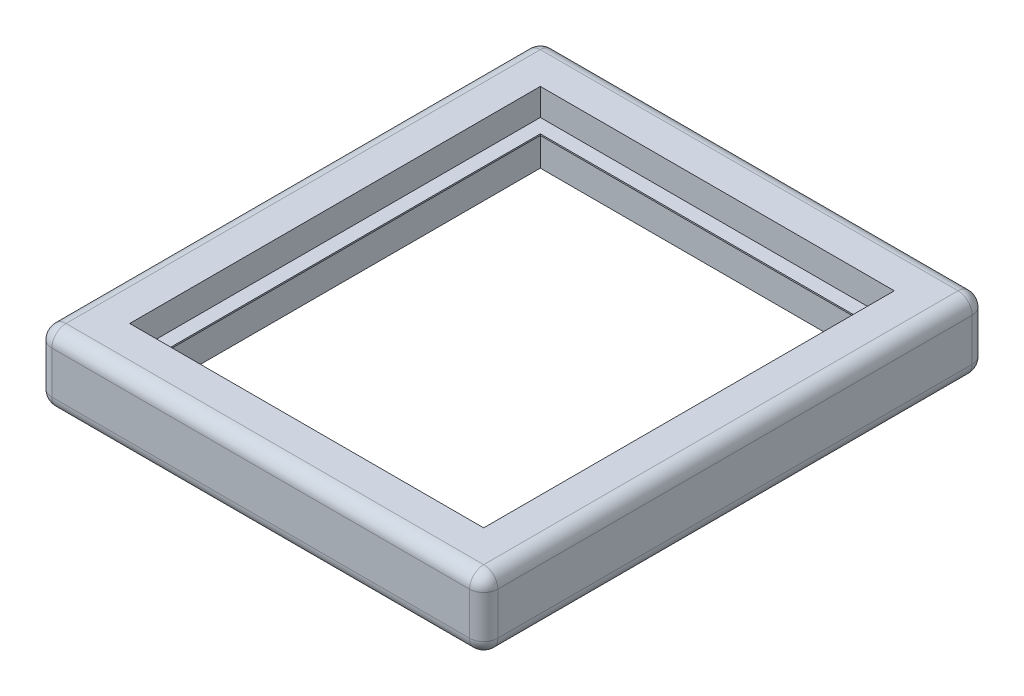
ISO-10303-21;
HEADER;
FILE_DESCRIPTION(('STEP AP214'),'2;1');
FILE_NAME('part.step','',(''),(''),'','','');
FILE_SCHEMA(('AUTOMOTIVE_DESIGN { 1 0 10303 214 1 1 1 1 }'));
ENDSEC;
DATA;
#1=APPLICATION_CONTEXT('core data for automotive mechanical design processes');
#2=APPLICATION_PROTOCOL_DEFINITION('international standard','automotive_design',2000,#1);
#3=PRODUCT_CONTEXT('',#1,'mechanical');
#4=PRODUCT('Part','Part','',(#3));
#5=PRODUCT_RELATED_PRODUCT_CATEGORY('part','',(#4));
#6=PRODUCT_DEFINITION_FORMATION('','',#4);
#7=PRODUCT_DEFINITION_CONTEXT('part definition',#1,'design');
#8=PRODUCT_DEFINITION('design','',#6,#7);
#9=PRODUCT_DEFINITION_SHAPE('','',#8);
#10=(LENGTH_UNIT() NAMED_UNIT(*) SI_UNIT(.MILLI.,.METRE.));
#11=(NAMED_UNIT(*) PLANE_ANGLE_UNIT() SI_UNIT($,.RADIAN.));
#12=(NAMED_UNIT(*) SI_UNIT($,.STERADIAN.) SOLID_ANGLE_UNIT());
#13=UNCERTAINTY_MEASURE_WITH_UNIT(LENGTH_MEASURE(1.E-05),#10,'distance_accuracy_value','');
#14=(GEOMETRIC_REPRESENTATION_CONTEXT(3) GLOBAL_UNCERTAINTY_ASSIGNED_CONTEXT((#13)) GLOBAL_UNIT_ASSIGNED_CONTEXT((#10,
#11,#12)) REPRESENTATION_CONTEXT('',''));
#15=CARTESIAN_POINT('',(0.,0.,0.));
#16=DIRECTION('',(0.,0.,1.));
#17=DIRECTION('',(1.,0.,0.));
#18=AXIS2_PLACEMENT_3D('',#15,#16,#17);
#19=CARTESIAN_POINT('',(317.5,-76.2,0.));
#20=DIRECTION('',(1.,0.,0.));
#21=DIRECTION('',(0.,0.,-1.));
#22=AXIS2_PLACEMENT_3D('',#19,#20,#21);
#23=PLANE('',#22);
#24=DIRECTION('',(0.,0.,-1.));
#25=VECTOR('',#24,1.);
#26=CARTESIAN_POINT('',(317.5,0.,0.));
#27=LINE('',#26,#25);
#28=CARTESIAN_POINT('',(317.5,0.,368.3));
#29=VERTEX_POINT('',#28);
#30=CARTESIAN_POINT('',(317.5,0.,-368.3));
#31=VERTEX_POINT('',#30);
#32=EDGE_CURVE('E420',#29,#31,#27,.T.);
#33=ORIENTED_EDGE('',*,*,#32,.T.);
#34=DIRECTION('',(0.,1.,0.));
#35=VECTOR('',#34,1.);
#36=CARTESIAN_POINT('',(317.5,-76.2,-368.3));
#37=LINE('',#36,#35);
#38=CARTESIAN_POINT('',(317.5,-76.2,-368.3));
#39=VERTEX_POINT('',#38);
#40=EDGE_CURVE('E256',#39,#31,#37,.T.);
#41=ORIENTED_EDGE('',*,*,#40,.F.);
#42=DIRECTION('',(0.,0.,-1.));
#43=VECTOR('',#42,1.);
#44=CARTESIAN_POINT('',(317.5,-76.2,0.));
#45=LINE('',#44,#43);
#46=CARTESIAN_POINT('',(317.5,-76.2,368.3));
#47=VERTEX_POINT('',#46);
#48=EDGE_CURVE('E480',#47,#39,#45,.T.);
#49=ORIENTED_EDGE('',*,*,#48,.F.);
#50=DIRECTION('',(0.,1.,0.));
#51=VECTOR('',#50,1.);
#52=CARTESIAN_POINT('',(317.5,-76.2,368.3));
#53=LINE('',#52,#51);
#54=EDGE_CURVE('E238',#47,#29,#53,.T.);
#55=ORIENTED_EDGE('',*,*,#54,.T.);
#56=EDGE_LOOP('',(#33,#41,#49,#55));
#57=FACE_BOUND('',#56,.T.);
#58=ADVANCED_FACE('F45',(#57),#23,.F.);
#59=CARTESIAN_POINT('',(0.,-76.2,-368.3));
#60=DIRECTION('',(0.,0.,1.));
#61=DIRECTION('',(1.,0.,0.));
#62=AXIS2_PLACEMENT_3D('',#59,#60,#61);
#63=PLANE('',#62);
#64=ORIENTED_EDGE('',*,*,#40,.T.);
#65=DIRECTION('',(1.,0.,0.));
#66=VECTOR('',#65,1.);
#67=CARTESIAN_POINT('',(0.,0.,-368.3));
#68=LINE('',#67,#66);
#69=CARTESIAN_POINT('',(-317.5,0.,-368.3));
#70=VERTEX_POINT('',#69);
#71=EDGE_CURVE('E426',#70,#31,#68,.T.);
#72=ORIENTED_EDGE('',*,*,#71,.F.);
#73=DIRECTION('',(0.,1.,0.));
#74=VECTOR('',#73,1.);
#75=CARTESIAN_POINT('',(-317.5,-76.2,-368.3));
#76=LINE('',#75,#74);
#77=CARTESIAN_POINT('',(-317.5,-76.2,-368.3));
#78=VERTEX_POINT('',#77);
#79=EDGE_CURVE('E491',#78,#70,#76,.T.);
#80=ORIENTED_EDGE('',*,*,#79,.F.);
#81=DIRECTION('',(1.,0.,0.));
#82=VECTOR('',#81,1.);
#83=CARTESIAN_POINT('',(0.,-76.2,-368.3));
#84=LINE('',#83,#82);
#85=EDGE_CURVE('E239',#78,#39,#84,.T.);
#86=ORIENTED_EDGE('',*,*,#85,.T.);
#87=EDGE_LOOP('',(#64,#72,#80,#86));
#88=FACE_BOUND('',#87,.T.);
#89=ADVANCED_FACE('F557',(#88),#63,.T.);
#90=CARTESIAN_POINT('',(-317.5,-76.2,0.));
#91=DIRECTION('',(1.,0.,0.));
#92=DIRECTION('',(0.,0.,-1.));
#93=AXIS2_PLACEMENT_3D('',#90,#91,#92);
#94=PLANE('',#93);
#95=ORIENTED_EDGE('',*,*,#79,.T.);
#96=DIRECTION('',(0.,0.,-1.));
#97=VECTOR('',#96,1.);
#98=CARTESIAN_POINT('',(-317.5,0.,0.));
#99=LINE('',#98,#97);
#100=CARTESIAN_POINT('',(-317.5,0.,368.3));
#101=VERTEX_POINT('',#100);
#102=EDGE_CURVE('E435',#101,#70,#99,.T.);
#103=ORIENTED_EDGE('',*,*,#102,.F.);
#104=DIRECTION('',(0.,1.,0.));
#105=VECTOR('',#104,1.);
#106=CARTESIAN_POINT('',(-317.5,-76.2,368.3));
#107=LINE('',#106,#105);
#108=CARTESIAN_POINT('',(-317.5,-76.2,368.3));
#109=VERTEX_POINT('',#108);
#110=EDGE_CURVE('E250',#109,#101,#107,.T.);
#111=ORIENTED_EDGE('',*,*,#110,.F.);
#112=DIRECTION('',(0.,0.,-1.));
#113=VECTOR('',#112,1.);
#114=CARTESIAN_POINT('',(-317.5,-76.2,0.));
#115=LINE('',#114,#113);
#116=EDGE_CURVE('E246',#109,#78,#115,.T.);
#117=ORIENTED_EDGE('',*,*,#116,.T.);
#118=EDGE_LOOP('',(#95,#103,#111,#117));
#119=FACE_BOUND('',#118,.T.);
#120=ADVANCED_FACE('F563',(#119),#94,.T.);
#121=CARTESIAN_POINT('',(0.,-76.2,368.3));
#122=DIRECTION('',(0.,0.,1.));
#123=DIRECTION('',(1.,0.,0.));
#124=AXIS2_PLACEMENT_3D('',#121,#122,#123);
#125=PLANE('',#124);
#126=DIRECTION('',(1.,0.,0.));
#127=VECTOR('',#126,1.);
#128=CARTESIAN_POINT('',(0.,0.,368.3));
#129=LINE('',#128,#127);
#130=EDGE_CURVE('E414',#101,#29,#129,.T.);
#131=ORIENTED_EDGE('',*,*,#130,.T.);
#132=ORIENTED_EDGE('',*,*,#54,.F.);
#133=DIRECTION('',(1.,0.,0.));
#134=VECTOR('',#133,1.);
#135=CARTESIAN_POINT('',(0.,-76.2,368.3));
#136=LINE('',#135,#134);
#137=EDGE_CURVE('E483',#109,#47,#136,.T.);
#138=ORIENTED_EDGE('',*,*,#137,.F.);
#139=ORIENTED_EDGE('',*,*,#110,.T.);
#140=EDGE_LOOP('',(#131,#132,#138,#139));
#141=FACE_BOUND('',#140,.T.);
#142=ADVANCED_FACE('F569',(#141),#125,.F.);
#143=CARTESIAN_POINT('',(317.5,2.54,-368.3));
#144=VERTEX_POINT('',#143);
#145=CARTESIAN_POINT('',(317.5,50.8,-368.3));
#146=VERTEX_POINT('',#145);
#147=EDGE_CURVE('E229',#144,#146,#37,.T.);
#148=ORIENTED_EDGE('',*,*,#147,.F.);
#149=DIRECTION('',(0.,0.,-1.));
#150=VECTOR('',#149,1.);
#151=CARTESIAN_POINT('',(317.5,2.54,0.));
#152=LINE('',#151,#150);
#153=CARTESIAN_POINT('',(317.5,2.54,368.3));
#154=VERTEX_POINT('',#153);
#155=EDGE_CURVE('E213',#154,#144,#152,.T.);
#156=ORIENTED_EDGE('',*,*,#155,.F.);
#157=CARTESIAN_POINT('',(317.5,50.8,368.3));
#158=VERTEX_POINT('',#157);
#159=EDGE_CURVE('E227',#154,#158,#53,.T.);
#160=ORIENTED_EDGE('',*,*,#159,.T.);
#161=DIRECTION('',(0.,0.,-1.));
#162=VECTOR('',#161,1.);
#163=CARTESIAN_POINT('',(317.5,50.8,0.));
#164=LINE('',#163,#162);
#165=EDGE_CURVE('E467',#158,#146,#164,.T.);
#166=ORIENTED_EDGE('',*,*,#165,.T.);
#167=EDGE_LOOP('',(#148,#156,#160,#166));
#168=FACE_BOUND('',#167,.T.);
#169=ADVANCED_FACE('F225',(#168),#23,.F.);
#170=DIRECTION('',(1.,0.,0.));
#171=VECTOR('',#170,1.);
#172=CARTESIAN_POINT('',(0.,2.54,-368.3));
#173=LINE('',#172,#171);
#174=CARTESIAN_POINT('',(-317.5,2.54,-368.3));
#175=VERTEX_POINT('',#174);
#176=EDGE_CURVE('E231',#175,#144,#173,.T.);
#177=ORIENTED_EDGE('',*,*,#176,.T.);
#178=ORIENTED_EDGE('',*,*,#147,.T.);
#179=DIRECTION('',(1.,0.,0.));
#180=VECTOR('',#179,1.);
#181=CARTESIAN_POINT('',(0.,50.8,-368.3));
#182=LINE('',#181,#180);
#183=CARTESIAN_POINT('',(-317.5,50.8,-368.3));
#184=VERTEX_POINT('',#183);
#185=EDGE_CURVE('E476',#184,#146,#182,.T.);
#186=ORIENTED_EDGE('',*,*,#185,.F.);
#187=EDGE_CURVE('E494',#175,#184,#76,.T.);
#188=ORIENTED_EDGE('',*,*,#187,.F.);
#189=EDGE_LOOP('',(#177,#178,#186,#188));
#190=FACE_BOUND('',#189,.T.);
#191=ADVANCED_FACE('F510',(#190),#63,.T.);
#192=DIRECTION('',(0.,0.,-1.));
#193=VECTOR('',#192,1.);
#194=CARTESIAN_POINT('',(-317.5,2.54,0.));
#195=LINE('',#194,#193);
#196=CARTESIAN_POINT('',(-317.5,2.53999999999997,368.3));
#197=VERTEX_POINT('',#196);
#198=EDGE_CURVE('E216',#197,#175,#195,.T.);
#199=ORIENTED_EDGE('',*,*,#198,.T.);
#200=ORIENTED_EDGE('',*,*,#187,.T.);
#201=DIRECTION('',(0.,0.,-1.));
#202=VECTOR('',#201,1.);
#203=CARTESIAN_POINT('',(-317.5,50.8,0.));
#204=LINE('',#203,#202);
#205=CARTESIAN_POINT('',(-317.5,50.8,368.3));
#206=VERTEX_POINT('',#205);
#207=EDGE_CURVE('E472',#206,#184,#204,.T.);
#208=ORIENTED_EDGE('',*,*,#207,.F.);
#209=EDGE_CURVE('E244',#197,#206,#107,.T.);
#210=ORIENTED_EDGE('',*,*,#209,.F.);
#211=EDGE_LOOP('',(#199,#200,#208,#210));
#212=FACE_BOUND('',#211,.T.);
#213=ADVANCED_FACE('F506',(#212),#94,.T.);
#214=CARTESIAN_POINT('',(-400.05,-76.2,0.));
#215=DIRECTION('',(1.,0.,0.));
#216=DIRECTION('',(0.,0.,-1.));
#217=AXIS2_PLACEMENT_3D('',#214,#215,#216);
#218=PLANE('',#217);
#219=DIRECTION('',(0.,1.,0.));
#220=VECTOR('',#219,1.);
#221=CARTESIAN_POINT('',(-400.05,-76.2,-425.45));
#222=LINE('',#221,#220);
#223=CARTESIAN_POINT('',(-400.05,25.4,-425.45));
#224=VERTEX_POINT('',#223);
#225=CARTESIAN_POINT('',(-400.05,-50.8,-425.45));
#226=VERTEX_POINT('',#225);
#227=EDGE_CURVE('E55',#224,#226,#222,.F.);
#228=ORIENTED_EDGE('',*,*,#227,.T.);
#229=DIRECTION('',(0.,0.,-1.));
#230=VECTOR('',#229,1.);
#231=CARTESIAN_POINT('',(-400.05,-50.8,0.));
#232=LINE('',#231,#230);
#233=CARTESIAN_POINT('',(-400.05,-50.8,425.45));
#234=VERTEX_POINT('',#233);
#235=EDGE_CURVE('E11',#226,#234,#232,.F.);
#236=ORIENTED_EDGE('',*,*,#235,.T.);
#237=DIRECTION('',(0.,1.,0.));
#238=VECTOR('',#237,1.);
#239=CARTESIAN_POINT('',(-400.05,50.8,425.45));
#240=LINE('',#239,#238);
#241=CARTESIAN_POINT('',(-400.05,25.4,425.45));
#242=VERTEX_POINT('',#241);
#243=EDGE_CURVE('E321',#234,#242,#240,.T.);
#244=ORIENTED_EDGE('',*,*,#243,.T.);
#245=DIRECTION('',(0.,0.,-1.));
#246=VECTOR('',#245,1.);
#247=CARTESIAN_POINT('',(-400.05,25.4,-450.85));
#248=LINE('',#247,#246);
#249=EDGE_CURVE('E318',#242,#224,#248,.T.);
#250=ORIENTED_EDGE('',*,*,#249,.T.);
#251=EDGE_LOOP('',(#228,#236,#244,#250));
#252=FACE_BOUND('',#251,.T.);
#253=ADVANCED_FACE('F597',(#252),#218,.F.);
#254=CARTESIAN_POINT('',(0.,-76.2,-450.85));
#255=DIRECTION('',(0.,0.,1.));
#256=DIRECTION('',(1.,0.,0.));
#257=AXIS2_PLACEMENT_3D('',#254,#255,#256);
#258=PLANE('',#257);
#259=DIRECTION('',(0.,1.,0.));
#260=VECTOR('',#259,1.);
#261=CARTESIAN_POINT('',(374.65,-76.2,-450.85));
#262=LINE('',#261,#260);
#263=CARTESIAN_POINT('',(374.65,25.4,-450.85));
#264=VERTEX_POINT('',#263);
#265=CARTESIAN_POINT('',(374.65,-50.8,-450.85));
#266=VERTEX_POINT('',#265);
#267=EDGE_CURVE('E311',#264,#266,#262,.F.);
#268=ORIENTED_EDGE('',*,*,#267,.T.);
#269=DIRECTION('',(1.,0.,0.));
#270=VECTOR('',#269,1.);
#271=CARTESIAN_POINT('',(0.,-50.8,-450.85));
#272=LINE('',#271,#270);
#273=CARTESIAN_POINT('',(-374.65,-50.8,-450.85));
#274=VERTEX_POINT('',#273);
#275=EDGE_CURVE('E315',#266,#274,#272,.F.);
#276=ORIENTED_EDGE('',*,*,#275,.T.);
#277=DIRECTION('',(0.,1.,0.));
#278=VECTOR('',#277,1.);
#279=CARTESIAN_POINT('',(-374.65,-76.2,-450.85));
#280=LINE('',#279,#278);
#281=CARTESIAN_POINT('',(-374.65,25.4,-450.85));
#282=VERTEX_POINT('',#281);
#283=EDGE_CURVE('E308',#274,#282,#280,.T.);
#284=ORIENTED_EDGE('',*,*,#283,.T.);
#285=DIRECTION('',(1.,0.,0.));
#286=VECTOR('',#285,1.);
#287=CARTESIAN_POINT('',(400.05,25.4,-450.85));
#288=LINE('',#287,#286);
#289=EDGE_CURVE('E305',#282,#264,#288,.T.);
#290=ORIENTED_EDGE('',*,*,#289,.T.);
#291=EDGE_LOOP('',(#268,#276,#284,#290));
#292=FACE_BOUND('',#291,.T.);
#293=ADVANCED_FACE('F593',(#292),#258,.F.);
#294=CARTESIAN_POINT('',(400.05,-76.2,0.));
#295=DIRECTION('',(1.,0.,0.));
#296=DIRECTION('',(0.,0.,-1.));
#297=AXIS2_PLACEMENT_3D('',#294,#295,#296);
#298=PLANE('',#297);
#299=DIRECTION('',(0.,1.,0.));
#300=VECTOR('',#299,1.);
#301=CARTESIAN_POINT('',(400.05,-76.2,425.45));
#302=LINE('',#301,#300);
#303=CARTESIAN_POINT('',(400.05,25.4,425.45));
#304=VERTEX_POINT('',#303);
#305=CARTESIAN_POINT('',(400.05,-50.8,425.45));
#306=VERTEX_POINT('',#305);
#307=EDGE_CURVE('E259',#304,#306,#302,.F.);
#308=ORIENTED_EDGE('',*,*,#307,.T.);
#309=DIRECTION('',(0.,0.,-1.));
#310=VECTOR('',#309,1.);
#311=CARTESIAN_POINT('',(400.05,-50.8,-450.85));
#312=LINE('',#311,#310);
#313=CARTESIAN_POINT('',(400.05,-50.8,-425.45));
#314=VERTEX_POINT('',#313);
#315=EDGE_CURVE('E262',#306,#314,#312,.T.);
#316=ORIENTED_EDGE('',*,*,#315,.T.);
#317=DIRECTION('',(0.,1.,0.));
#318=VECTOR('',#317,1.);
#319=CARTESIAN_POINT('',(400.05,50.8,-425.45));
#320=LINE('',#319,#318);
#321=CARTESIAN_POINT('',(400.05,25.4,-425.45));
#322=VERTEX_POINT('',#321);
#323=EDGE_CURVE('E252',#314,#322,#320,.T.);
#324=ORIENTED_EDGE('',*,*,#323,.T.);
#325=DIRECTION('',(0.,0.,-1.));
#326=VECTOR('',#325,1.);
#327=CARTESIAN_POINT('',(400.05,25.4,0.));
#328=LINE('',#327,#326);
#329=EDGE_CURVE('E255',#322,#304,#328,.F.);
#330=ORIENTED_EDGE('',*,*,#329,.T.);
#331=EDGE_LOOP('',(#308,#316,#324,#330));
#332=FACE_BOUND('',#331,.T.);
#333=ADVANCED_FACE('F587',(#332),#298,.T.);
#334=CARTESIAN_POINT('',(0.,-76.2,450.85));
#335=DIRECTION('',(0.,0.,1.));
#336=DIRECTION('',(1.,0.,0.));
#337=AXIS2_PLACEMENT_3D('',#334,#335,#336);
#338=PLANE('',#337);
#339=DIRECTION('',(0.,1.,0.));
#340=VECTOR('',#339,1.);
#341=CARTESIAN_POINT('',(-374.65,-76.2,450.85));
#342=LINE('',#341,#340);
#343=CARTESIAN_POINT('',(-374.65,25.4,450.85));
#344=VERTEX_POINT('',#343);
#345=CARTESIAN_POINT('',(-374.65,-50.8,450.85));
#346=VERTEX_POINT('',#345);
#347=EDGE_CURVE('E282',#344,#346,#342,.F.);
#348=ORIENTED_EDGE('',*,*,#347,.T.);
#349=DIRECTION('',(1.,0.,0.));
#350=VECTOR('',#349,1.);
#351=CARTESIAN_POINT('',(400.05,-50.8,450.85));
#352=LINE('',#351,#350);
#353=CARTESIAN_POINT('',(374.65,-50.8,450.85));
#354=VERTEX_POINT('',#353);
#355=EDGE_CURVE('E289',#346,#354,#352,.T.);
#356=ORIENTED_EDGE('',*,*,#355,.T.);
#357=DIRECTION('',(0.,1.,0.));
#358=VECTOR('',#357,1.);
#359=CARTESIAN_POINT('',(374.65,-76.2,450.85));
#360=LINE('',#359,#358);
#361=CARTESIAN_POINT('',(374.65,25.4,450.85));
#362=VERTEX_POINT('',#361);
#363=EDGE_CURVE('E285',#354,#362,#360,.T.);
#364=ORIENTED_EDGE('',*,*,#363,.T.);
#365=DIRECTION('',(1.,0.,0.));
#366=VECTOR('',#365,1.);
#367=CARTESIAN_POINT('',(0.,25.4,450.85));
#368=LINE('',#367,#366);
#369=EDGE_CURVE('E279',#362,#344,#368,.F.);
#370=ORIENTED_EDGE('',*,*,#369,.T.);
#371=EDGE_LOOP('',(#348,#356,#364,#370));
#372=FACE_BOUND('',#371,.T.);
#373=ADVANCED_FACE('F580',(#372),#338,.T.);
#374=ORIENTED_EDGE('',*,*,#159,.F.);
#375=DIRECTION('',(1.,0.,0.));
#376=VECTOR('',#375,1.);
#377=CARTESIAN_POINT('',(0.,2.54,368.3));
#378=LINE('',#377,#376);
#379=EDGE_CURVE('E209',#197,#154,#378,.T.);
#380=ORIENTED_EDGE('',*,*,#379,.F.);
#381=ORIENTED_EDGE('',*,*,#209,.T.);
#382=DIRECTION('',(1.,0.,0.));
#383=VECTOR('',#382,1.);
#384=CARTESIAN_POINT('',(0.,50.8,368.3));
#385=LINE('',#384,#383);
#386=EDGE_CURVE('E236',#206,#158,#385,.T.);
#387=ORIENTED_EDGE('',*,*,#386,.T.);
#388=EDGE_LOOP('',(#374,#380,#381,#387));
#389=FACE_BOUND('',#388,.T.);
#390=ADVANCED_FACE('F234',(#389),#125,.F.);
#391=CARTESIAN_POINT('',(0.,-76.2,0.));
#392=DIRECTION('',(0.,1.,0.));
#393=DIRECTION('',(0.,0.,1.));
#394=AXIS2_PLACEMENT_3D('',#391,#392,#393);
#395=PLANE('',#394);
#396=DIRECTION('',(0.,0.,-1.));
#397=VECTOR('',#396,1.);
#398=CARTESIAN_POINT('',(-374.65,-76.2,0.));
#399=LINE('',#398,#397);
#400=CARTESIAN_POINT('',(-374.65,-76.2,425.45));
#401=VERTEX_POINT('',#400);
#402=CARTESIAN_POINT('',(-374.65,-76.2,-425.45));
#403=VERTEX_POINT('',#402);
#404=EDGE_CURVE('E269',#401,#403,#399,.T.);
#405=ORIENTED_EDGE('',*,*,#404,.T.);
#406=DIRECTION('',(1.,0.,0.));
#407=VECTOR('',#406,1.);
#408=CARTESIAN_POINT('',(0.,-76.2,-425.45));
#409=LINE('',#408,#407);
#410=CARTESIAN_POINT('',(374.65,-76.2,-425.45));
#411=VERTEX_POINT('',#410);
#412=EDGE_CURVE('E276',#403,#411,#409,.T.);
#413=ORIENTED_EDGE('',*,*,#412,.T.);
#414=DIRECTION('',(0.,0.,-1.));
#415=VECTOR('',#414,1.);
#416=CARTESIAN_POINT('',(374.65,-76.2,450.85));
#417=LINE('',#416,#415);
#418=CARTESIAN_POINT('',(374.65,-76.2,425.45));
#419=VERTEX_POINT('',#418);
#420=EDGE_CURVE('E272',#411,#419,#417,.F.);
#421=ORIENTED_EDGE('',*,*,#420,.T.);
#422=DIRECTION('',(1.,0.,0.));
#423=VECTOR('',#422,1.);
#424=CARTESIAN_POINT('',(-400.05,-76.2,425.45));
#425=LINE('',#424,#423);
#426=EDGE_CURVE('E266',#419,#401,#425,.F.);
#427=ORIENTED_EDGE('',*,*,#426,.T.);
#428=EDGE_LOOP('',(#405,#413,#421,#427));
#429=FACE_BOUND('',#428,.T.);
#430=ORIENTED_EDGE('',*,*,#48,.T.);
#431=ORIENTED_EDGE('',*,*,#85,.F.);
#432=ORIENTED_EDGE('',*,*,#116,.F.);
#433=ORIENTED_EDGE('',*,*,#137,.T.);
#434=EDGE_LOOP('',(#430,#431,#432,#433));
#435=FACE_BOUND('',#434,.T.);
#436=ADVANCED_FACE('F579',(#429,#435),#395,.F.);
#437=CARTESIAN_POINT('',(0.,50.8,0.));
#438=DIRECTION('',(0.,1.,0.));
#439=DIRECTION('',(0.,0.,1.));
#440=AXIS2_PLACEMENT_3D('',#437,#438,#439);
#441=PLANE('',#440);
#442=DIRECTION('',(1.,0.,0.));
#443=VECTOR('',#442,1.);
#444=CARTESIAN_POINT('',(0.,50.8,425.45));
#445=LINE('',#444,#443);
#446=CARTESIAN_POINT('',(-374.65,50.8,425.45));
#447=VERTEX_POINT('',#446);
#448=CARTESIAN_POINT('',(374.65,50.8,425.45));
#449=VERTEX_POINT('',#448);
#450=EDGE_CURVE('E298',#447,#449,#445,.T.);
#451=ORIENTED_EDGE('',*,*,#450,.T.);
#452=DIRECTION('',(0.,0.,-1.));
#453=VECTOR('',#452,1.);
#454=CARTESIAN_POINT('',(374.65,50.8,0.));
#455=LINE('',#454,#453);
#456=CARTESIAN_POINT('',(374.65,50.8,-425.45));
#457=VERTEX_POINT('',#456);
#458=EDGE_CURVE('E301',#449,#457,#455,.T.);
#459=ORIENTED_EDGE('',*,*,#458,.T.);
#460=DIRECTION('',(1.,0.,0.));
#461=VECTOR('',#460,1.);
#462=CARTESIAN_POINT('',(-400.05,50.8,-425.45));
#463=LINE('',#462,#461);
#464=CARTESIAN_POINT('',(-374.65,50.8,-425.45));
#465=VERTEX_POINT('',#464);
#466=EDGE_CURVE('E295',#457,#465,#463,.F.);
#467=ORIENTED_EDGE('',*,*,#466,.T.);
#468=DIRECTION('',(0.,0.,-1.));
#469=VECTOR('',#468,1.);
#470=CARTESIAN_POINT('',(-374.65,50.8,450.85));
#471=LINE('',#470,#469);
#472=EDGE_CURVE('E292',#465,#447,#471,.F.);
#473=ORIENTED_EDGE('',*,*,#472,.T.);
#474=EDGE_LOOP('',(#451,#459,#467,#473));
#475=FACE_BOUND('',#474,.T.);
#476=ORIENTED_EDGE('',*,*,#165,.F.);
#477=ORIENTED_EDGE('',*,*,#386,.F.);
#478=ORIENTED_EDGE('',*,*,#207,.T.);
#479=ORIENTED_EDGE('',*,*,#185,.T.);
#480=EDGE_LOOP('',(#476,#477,#478,#479));
#481=FACE_BOUND('',#480,.T.);
#482=ADVANCED_FACE('F508',(#475,#481),#441,.T.);
#483=CARTESIAN_POINT('',(0.,2.54,342.9));
#484=DIRECTION('',(0.,0.,-1.));
#485=DIRECTION('',(-1.,0.,0.));
#486=AXIS2_PLACEMENT_3D('',#483,#484,#485);
#487=PLANE('',#486);
#488=DIRECTION('',(1.,0.,0.));
#489=VECTOR('',#488,1.);
#490=CARTESIAN_POINT('',(0.,0.,342.9));
#491=LINE('',#490,#489);
#492=CARTESIAN_POINT('',(-292.1,0.,342.9));
#493=VERTEX_POINT('',#492);
#494=CARTESIAN_POINT('',(292.1,0.,342.9));
#495=VERTEX_POINT('',#494);
#496=EDGE_CURVE('E439',#493,#495,#491,.T.);
#497=ORIENTED_EDGE('',*,*,#496,.F.);
#498=DIRECTION('',(0.,-1.,0.));
#499=VECTOR('',#498,1.);
#500=CARTESIAN_POINT('',(-292.1,2.54,342.9));
#501=LINE('',#500,#499);
#502=CARTESIAN_POINT('',(-292.1,2.54,342.9));
#503=VERTEX_POINT('',#502);
#504=EDGE_CURVE('E464',#503,#493,#501,.T.);
#505=ORIENTED_EDGE('',*,*,#504,.F.);
#506=DIRECTION('',(1.,0.,0.));
#507=VECTOR('',#506,1.);
#508=CARTESIAN_POINT('',(0.,2.54,342.9));
#509=LINE('',#508,#507);
#510=CARTESIAN_POINT('',(292.1,2.54,342.9));
#511=VERTEX_POINT('',#510);
#512=EDGE_CURVE('E514',#503,#511,#509,.T.);
#513=ORIENTED_EDGE('',*,*,#512,.T.);
#514=DIRECTION('',(0.,-1.,0.));
#515=VECTOR('',#514,1.);
#516=CARTESIAN_POINT('',(292.1,2.54,342.9));
#517=LINE('',#516,#515);
#518=EDGE_CURVE('E454',#511,#495,#517,.T.);
#519=ORIENTED_EDGE('',*,*,#518,.T.);
#520=EDGE_LOOP('',(#497,#505,#513,#519));
#521=FACE_BOUND('',#520,.T.);
#522=ADVANCED_FACE('F537',(#521),#487,.T.);
#523=CARTESIAN_POINT('',(-292.1,2.54,0.));
#524=DIRECTION('',(-1.,0.,0.));
#525=DIRECTION('',(0.,0.,1.));
#526=AXIS2_PLACEMENT_3D('',#523,#524,#525);
#527=PLANE('',#526);
#528=DIRECTION('',(0.,0.,-1.));
#529=VECTOR('',#528,1.);
#530=CARTESIAN_POINT('',(-292.1,0.,0.));
#531=LINE('',#530,#529);
#532=CARTESIAN_POINT('',(-292.1,0.,-342.9));
#533=VERTEX_POINT('',#532);
#534=EDGE_CURVE('E443',#493,#533,#531,.T.);
#535=ORIENTED_EDGE('',*,*,#534,.T.);
#536=DIRECTION('',(0.,-1.,0.));
#537=VECTOR('',#536,1.);
#538=CARTESIAN_POINT('',(-292.1,2.54,-342.9));
#539=LINE('',#538,#537);
#540=CARTESIAN_POINT('',(-292.1,2.54,-342.9));
#541=VERTEX_POINT('',#540);
#542=EDGE_CURVE('E460',#541,#533,#539,.T.);
#543=ORIENTED_EDGE('',*,*,#542,.F.);
#544=DIRECTION('',(0.,0.,-1.));
#545=VECTOR('',#544,1.);
#546=CARTESIAN_POINT('',(-292.1,2.54,0.));
#547=LINE('',#546,#545);
#548=EDGE_CURVE('E520',#503,#541,#547,.T.);
#549=ORIENTED_EDGE('',*,*,#548,.F.);
#550=ORIENTED_EDGE('',*,*,#504,.T.);
#551=EDGE_LOOP('',(#535,#543,#549,#550));
#552=FACE_BOUND('',#551,.T.);
#553=ADVANCED_FACE('F540',(#552),#527,.F.);
#554=CARTESIAN_POINT('',(0.,2.54,-342.9));
#555=DIRECTION('',(0.,0.,-1.));
#556=DIRECTION('',(-1.,0.,0.));
#557=AXIS2_PLACEMENT_3D('',#554,#555,#556);
#558=PLANE('',#557);
#559=DIRECTION('',(1.,0.,0.));
#560=VECTOR('',#559,1.);
#561=CARTESIAN_POINT('',(0.,0.,-342.9));
#562=LINE('',#561,#560);
#563=CARTESIAN_POINT('',(292.1,0.,-342.9));
#564=VERTEX_POINT('',#563);
#565=EDGE_CURVE('E447',#533,#564,#562,.T.);
#566=ORIENTED_EDGE('',*,*,#565,.T.);
#567=DIRECTION('',(0.,-1.,0.));
#568=VECTOR('',#567,1.);
#569=CARTESIAN_POINT('',(292.1,2.54,-342.9));
#570=LINE('',#569,#568);
#571=CARTESIAN_POINT('',(292.1,2.54,-342.9));
#572=VERTEX_POINT('',#571);
#573=EDGE_CURVE('E457',#572,#564,#570,.T.);
#574=ORIENTED_EDGE('',*,*,#573,.F.);
#575=DIRECTION('',(1.,0.,0.));
#576=VECTOR('',#575,1.);
#577=CARTESIAN_POINT('',(0.,2.54,-342.9));
#578=LINE('',#577,#576);
#579=EDGE_CURVE('E523',#541,#572,#578,.T.);
#580=ORIENTED_EDGE('',*,*,#579,.F.);
#581=ORIENTED_EDGE('',*,*,#542,.T.);
#582=EDGE_LOOP('',(#566,#574,#580,#581));
#583=FACE_BOUND('',#582,.T.);
#584=ADVANCED_FACE('F542',(#583),#558,.F.);
#585=CARTESIAN_POINT('',(292.1,2.54,0.));
#586=DIRECTION('',(-1.,0.,0.));
#587=DIRECTION('',(0.,0.,1.));
#588=AXIS2_PLACEMENT_3D('',#585,#586,#587);
#589=PLANE('',#588);
#590=DIRECTION('',(0.,0.,-1.));
#591=VECTOR('',#590,1.);
#592=CARTESIAN_POINT('',(292.1,0.,0.));
#593=LINE('',#592,#591);
#594=EDGE_CURVE('E221',#495,#564,#593,.T.);
#595=ORIENTED_EDGE('',*,*,#594,.F.);
#596=ORIENTED_EDGE('',*,*,#518,.F.);
#597=DIRECTION('',(0.,0.,-1.));
#598=VECTOR('',#597,1.);
#599=CARTESIAN_POINT('',(292.1,2.54,0.));
#600=LINE('',#599,#598);
#601=EDGE_CURVE('E429',#511,#572,#600,.T.);
#602=ORIENTED_EDGE('',*,*,#601,.T.);
#603=ORIENTED_EDGE('',*,*,#573,.T.);
#604=EDGE_LOOP('',(#595,#596,#602,#603));
#605=FACE_BOUND('',#604,.T.);
#606=ADVANCED_FACE('F531',(#605),#589,.T.);
#607=CARTESIAN_POINT('',(0.,2.54,0.));
#608=DIRECTION('',(0.,1.,0.));
#609=DIRECTION('',(0.,0.,1.));
#610=AXIS2_PLACEMENT_3D('',#607,#608,#609);
#611=PLANE('',#610);
#612=ORIENTED_EDGE('',*,*,#379,.T.);
#613=ORIENTED_EDGE('',*,*,#155,.T.);
#614=ORIENTED_EDGE('',*,*,#176,.F.);
#615=ORIENTED_EDGE('',*,*,#198,.F.);
#616=EDGE_LOOP('',(#612,#613,#614,#615));
#617=FACE_BOUND('',#616,.T.);
#618=ORIENTED_EDGE('',*,*,#512,.F.);
#619=ORIENTED_EDGE('',*,*,#548,.T.);
#620=ORIENTED_EDGE('',*,*,#579,.T.);
#621=ORIENTED_EDGE('',*,*,#601,.F.);
#622=EDGE_LOOP('',(#618,#619,#620,#621));
#623=FACE_BOUND('',#622,.T.);
#624=ADVANCED_FACE('F211',(#617,#623),#611,.T.);
#625=CARTESIAN_POINT('',(0.,0.,0.));
#626=DIRECTION('',(0.,1.,0.));
#627=DIRECTION('',(0.,0.,1.));
#628=AXIS2_PLACEMENT_3D('',#625,#626,#627);
#629=PLANE('',#628);
#630=ORIENTED_EDGE('',*,*,#130,.F.);
#631=ORIENTED_EDGE('',*,*,#102,.T.);
#632=ORIENTED_EDGE('',*,*,#71,.T.);
#633=ORIENTED_EDGE('',*,*,#32,.F.);
#634=EDGE_LOOP('',(#630,#631,#632,#633));
#635=FACE_BOUND('',#634,.T.);
#636=ORIENTED_EDGE('',*,*,#496,.T.);
#637=ORIENTED_EDGE('',*,*,#594,.T.);
#638=ORIENTED_EDGE('',*,*,#565,.F.);
#639=ORIENTED_EDGE('',*,*,#534,.F.);
#640=EDGE_LOOP('',(#636,#637,#638,#639));
#641=FACE_BOUND('',#640,.T.);
#642=ADVANCED_FACE('F544',(#635,#641),#629,.F.);
#643=CARTESIAN_POINT('',(-374.65,25.4,0.));
#644=DIRECTION('',(0.,0.,1.));
#645=DIRECTION('',(1.,0.,0.));
#646=AXIS2_PLACEMENT_3D('',#643,#644,#645);
#647=CYLINDRICAL_SURFACE('',#646,25.4);
#648=CARTESIAN_POINT('',(-374.65,25.4,425.45));
#649=DIRECTION('',(0.,0.,1.));
#650=DIRECTION('',(1.,0.,0.));
#651=AXIS2_PLACEMENT_3D('',#648,#649,#650);
#652=CIRCLE('',#651,25.4);
#653=EDGE_CURVE('E49',#447,#242,#652,.T.);
#654=ORIENTED_EDGE('',*,*,#653,.F.);
#655=ORIENTED_EDGE('',*,*,#472,.F.);
#656=CARTESIAN_POINT('',(-374.65,25.4,-425.45));
#657=DIRECTION('',(0.,0.,-1.));
#658=DIRECTION('',(-1.,0.,0.));
#659=AXIS2_PLACEMENT_3D('',#656,#657,#658);
#660=CIRCLE('',#659,25.4);
#661=EDGE_CURVE('E405',#224,#465,#660,.T.);
#662=ORIENTED_EDGE('',*,*,#661,.F.);
#663=ORIENTED_EDGE('',*,*,#249,.F.);
#664=EDGE_LOOP('',(#654,#655,#662,#663));
#665=FACE_BOUND('',#664,.T.);
#666=ADVANCED_FACE('F47',(#665),#647,.T.);
#667=CARTESIAN_POINT('',(-374.65,25.4,425.45));
#668=DIRECTION('',(-1.,0.,0.));
#669=DIRECTION('',(0.,-1.,0.));
#670=AXIS2_PLACEMENT_3D('',#667,#668,#669);
#671=SPHERICAL_SURFACE('',#670,25.4);
#672=CARTESIAN_POINT('',(-374.65,25.4,425.45));
#673=DIRECTION('',(-1.,0.,0.));
#674=DIRECTION('',(0.,0.,1.));
#675=AXIS2_PLACEMENT_3D('',#672,#673,#674);
#676=CIRCLE('',#675,25.4);
#677=EDGE_CURVE('E398',#447,#344,#676,.F.);
#678=ORIENTED_EDGE('',*,*,#677,.F.);
#679=ORIENTED_EDGE('',*,*,#653,.T.);
#680=CARTESIAN_POINT('',(-374.65,25.4,425.45));
#681=DIRECTION('',(0.,1.,0.));
#682=DIRECTION('',(0.,0.,1.));
#683=AXIS2_PLACEMENT_3D('',#680,#681,#682);
#684=CIRCLE('',#683,25.4);
#685=EDGE_CURVE('E402',#344,#242,#684,.F.);
#686=ORIENTED_EDGE('',*,*,#685,.F.);
#687=EDGE_LOOP('',(#678,#679,#686));
#688=FACE_BOUND('',#687,.T.);
#689=ADVANCED_FACE('F552',(#688),#671,.T.);
#690=CARTESIAN_POINT('',(-374.65,25.4,-425.45));
#691=DIRECTION('',(0.,1.,0.));
#692=DIRECTION('',(0.,0.,1.));
#693=AXIS2_PLACEMENT_3D('',#690,#691,#692);
#694=SPHERICAL_SURFACE('',#693,25.4);
#695=CARTESIAN_POINT('',(-374.65,25.4,-425.45));
#696=DIRECTION('',(0.,1.,0.));
#697=DIRECTION('',(0.,0.,1.));
#698=AXIS2_PLACEMENT_3D('',#695,#696,#697);
#699=CIRCLE('',#698,25.4);
#700=EDGE_CURVE('E390',#224,#282,#699,.F.);
#701=ORIENTED_EDGE('',*,*,#700,.F.);
#702=ORIENTED_EDGE('',*,*,#661,.T.);
#703=CARTESIAN_POINT('',(-374.65,25.4,-425.45));
#704=DIRECTION('',(-1.,0.,0.));
#705=DIRECTION('',(0.,0.,1.));
#706=AXIS2_PLACEMENT_3D('',#703,#704,#705);
#707=CIRCLE('',#706,25.4);
#708=EDGE_CURVE('E394',#282,#465,#707,.F.);
#709=ORIENTED_EDGE('',*,*,#708,.F.);
#710=EDGE_LOOP('',(#701,#702,#709));
#711=FACE_BOUND('',#710,.T.);
#712=ADVANCED_FACE('F666',(#711),#694,.T.);
#713=CARTESIAN_POINT('',(-374.65,-76.2,425.45));
#714=DIRECTION('',(0.,-1.,0.));
#715=DIRECTION('',(0.,0.,-1.));
#716=AXIS2_PLACEMENT_3D('',#713,#714,#715);
#717=CYLINDRICAL_SURFACE('',#716,25.4);
#718=ORIENTED_EDGE('',*,*,#685,.T.);
#719=ORIENTED_EDGE('',*,*,#243,.F.);
#720=CARTESIAN_POINT('',(-374.65,-50.8,425.45));
#721=DIRECTION('',(0.,-1.,0.));
#722=DIRECTION('',(0.,0.,-1.));
#723=AXIS2_PLACEMENT_3D('',#720,#721,#722);
#724=CIRCLE('',#723,25.4);
#725=EDGE_CURVE('E382',#346,#234,#724,.T.);
#726=ORIENTED_EDGE('',*,*,#725,.F.);
#727=ORIENTED_EDGE('',*,*,#347,.F.);
#728=EDGE_LOOP('',(#718,#719,#726,#727));
#729=FACE_BOUND('',#728,.T.);
#730=ADVANCED_FACE('F662',(#729),#717,.T.);
#731=CARTESIAN_POINT('',(0.,25.4,425.45));
#732=DIRECTION('',(1.,0.,0.));
#733=DIRECTION('',(0.,0.,-1.));
#734=AXIS2_PLACEMENT_3D('',#731,#732,#733);
#735=CYLINDRICAL_SURFACE('',#734,25.4);
#736=ORIENTED_EDGE('',*,*,#677,.T.);
#737=ORIENTED_EDGE('',*,*,#369,.F.);
#738=CARTESIAN_POINT('',(374.65,25.4,425.45));
#739=DIRECTION('',(1.,0.,0.));
#740=DIRECTION('',(0.,0.,-1.));
#741=AXIS2_PLACEMENT_3D('',#738,#739,#740);
#742=CIRCLE('',#741,25.4);
#743=EDGE_CURVE('E378',#449,#362,#742,.T.);
#744=ORIENTED_EDGE('',*,*,#743,.F.);
#745=ORIENTED_EDGE('',*,*,#450,.F.);
#746=EDGE_LOOP('',(#736,#737,#744,#745));
#747=FACE_BOUND('',#746,.T.);
#748=ADVANCED_FACE('F658',(#747),#735,.T.);
#749=CARTESIAN_POINT('',(374.65,25.4,0.));
#750=DIRECTION('',(0.,0.,-1.));
#751=DIRECTION('',(-1.,0.,0.));
#752=AXIS2_PLACEMENT_3D('',#749,#750,#751);
#753=CYLINDRICAL_SURFACE('',#752,25.4);
#754=CARTESIAN_POINT('',(374.65,25.4,-425.45));
#755=DIRECTION('',(0.,0.,-1.));
#756=DIRECTION('',(-1.,0.,0.));
#757=AXIS2_PLACEMENT_3D('',#754,#755,#756);
#758=CIRCLE('',#757,25.4);
#759=EDGE_CURVE('E370',#457,#322,#758,.T.);
#760=ORIENTED_EDGE('',*,*,#759,.F.);
#761=ORIENTED_EDGE('',*,*,#458,.F.);
#762=CARTESIAN_POINT('',(374.65,25.4,425.45));
#763=DIRECTION('',(0.,0.,1.));
#764=DIRECTION('',(1.,0.,0.));
#765=AXIS2_PLACEMENT_3D('',#762,#763,#764);
#766=CIRCLE('',#765,25.4);
#767=EDGE_CURVE('E374',#304,#449,#766,.T.);
#768=ORIENTED_EDGE('',*,*,#767,.F.);
#769=ORIENTED_EDGE('',*,*,#329,.F.);
#770=EDGE_LOOP('',(#760,#761,#768,#769));
#771=FACE_BOUND('',#770,.T.);
#772=ADVANCED_FACE('F654',(#771),#753,.T.);
#773=CARTESIAN_POINT('',(0.,25.4,-425.45));
#774=DIRECTION('',(-1.,0.,0.));
#775=DIRECTION('',(0.,0.,1.));
#776=AXIS2_PLACEMENT_3D('',#773,#774,#775);
#777=CYLINDRICAL_SURFACE('',#776,25.4);
#778=ORIENTED_EDGE('',*,*,#708,.T.);
#779=ORIENTED_EDGE('',*,*,#466,.F.);
#780=CARTESIAN_POINT('',(374.65,25.4,-425.45));
#781=DIRECTION('',(1.,0.,0.));
#782=DIRECTION('',(0.,0.,-1.));
#783=AXIS2_PLACEMENT_3D('',#780,#781,#782);
#784=CIRCLE('',#783,25.4);
#785=EDGE_CURVE('E367',#264,#457,#784,.T.);
#786=ORIENTED_EDGE('',*,*,#785,.F.);
#787=ORIENTED_EDGE('',*,*,#289,.F.);
#788=EDGE_LOOP('',(#778,#779,#786,#787));
#789=FACE_BOUND('',#788,.T.);
#790=ADVANCED_FACE('F650',(#789),#777,.T.);
#791=CARTESIAN_POINT('',(-374.65,-76.2,-425.45));
#792=DIRECTION('',(0.,1.,0.));
#793=DIRECTION('',(0.,0.,1.));
#794=AXIS2_PLACEMENT_3D('',#791,#792,#793);
#795=CYLINDRICAL_SURFACE('',#794,25.4);
#796=ORIENTED_EDGE('',*,*,#700,.T.);
#797=ORIENTED_EDGE('',*,*,#283,.F.);
#798=CARTESIAN_POINT('',(-374.65,-50.8,-425.45));
#799=DIRECTION('',(0.,-1.,0.));
#800=DIRECTION('',(0.,0.,-1.));
#801=AXIS2_PLACEMENT_3D('',#798,#799,#800);
#802=CIRCLE('',#801,25.4);
#803=EDGE_CURVE('E364',#226,#274,#802,.T.);
#804=ORIENTED_EDGE('',*,*,#803,.F.);
#805=ORIENTED_EDGE('',*,*,#227,.F.);
#806=EDGE_LOOP('',(#796,#797,#804,#805));
#807=FACE_BOUND('',#806,.T.);
#808=ADVANCED_FACE('F646',(#807),#795,.T.);
#809=CARTESIAN_POINT('',(-374.65,-50.8,0.));
#810=DIRECTION('',(0.,0.,-1.));
#811=DIRECTION('',(-1.,0.,0.));
#812=AXIS2_PLACEMENT_3D('',#809,#810,#811);
#813=CYLINDRICAL_SURFACE('',#812,25.4);
#814=CARTESIAN_POINT('',(-374.65,-50.8,425.45));
#815=DIRECTION('',(0.,0.,1.));
#816=DIRECTION('',(1.,0.,0.));
#817=AXIS2_PLACEMENT_3D('',#814,#815,#816);
#818=CIRCLE('',#817,25.4);
#819=EDGE_CURVE('E386',#234,#401,#818,.T.);
#820=ORIENTED_EDGE('',*,*,#819,.F.);
#821=ORIENTED_EDGE('',*,*,#235,.F.);
#822=CARTESIAN_POINT('',(-374.65,-50.8,-425.45));
#823=DIRECTION('',(0.,0.,-1.));
#824=DIRECTION('',(-1.,0.,0.));
#825=AXIS2_PLACEMENT_3D('',#822,#823,#824);
#826=CIRCLE('',#825,25.4);
#827=EDGE_CURVE('E63',#403,#226,#826,.T.);
#828=ORIENTED_EDGE('',*,*,#827,.F.);
#829=ORIENTED_EDGE('',*,*,#404,.F.);
#830=EDGE_LOOP('',(#820,#821,#828,#829));
#831=FACE_BOUND('',#830,.T.);
#832=ADVANCED_FACE('F642',(#831),#813,.T.);
#833=CARTESIAN_POINT('',(-374.65,-50.8,425.45));
#834=DIRECTION('',(-1.,0.,0.));
#835=DIRECTION('',(0.,0.,1.));
#836=AXIS2_PLACEMENT_3D('',#833,#834,#835);
#837=SPHERICAL_SURFACE('',#836,25.4);
#838=ORIENTED_EDGE('',*,*,#725,.T.);
#839=ORIENTED_EDGE('',*,*,#819,.T.);
#840=CARTESIAN_POINT('',(-374.65,-50.8,425.45));
#841=DIRECTION('',(-1.,0.,0.));
#842=DIRECTION('',(0.,0.,1.));
#843=AXIS2_PLACEMENT_3D('',#840,#841,#842);
#844=CIRCLE('',#843,25.4);
#845=EDGE_CURVE('E358',#346,#401,#844,.F.);
#846=ORIENTED_EDGE('',*,*,#845,.F.);
#847=EDGE_LOOP('',(#838,#839,#846));
#848=FACE_BOUND('',#847,.T.);
#849=ADVANCED_FACE('F638',(#848),#837,.T.);
#850=CARTESIAN_POINT('',(374.65,25.4,425.45));
#851=DIRECTION('',(0.,1.,0.));
#852=DIRECTION('',(0.,0.,1.));
#853=AXIS2_PLACEMENT_3D('',#850,#851,#852);
#854=SPHERICAL_SURFACE('',#853,25.4);
#855=ORIENTED_EDGE('',*,*,#767,.T.);
#856=ORIENTED_EDGE('',*,*,#743,.T.);
#857=CARTESIAN_POINT('',(374.65,25.4,425.45));
#858=DIRECTION('',(0.,1.,0.));
#859=DIRECTION('',(0.,0.,1.));
#860=AXIS2_PLACEMENT_3D('',#857,#858,#859);
#861=CIRCLE('',#860,25.4);
#862=EDGE_CURVE('E355',#304,#362,#861,.F.);
#863=ORIENTED_EDGE('',*,*,#862,.F.);
#864=EDGE_LOOP('',(#855,#856,#863));
#865=FACE_BOUND('',#864,.T.);
#866=ADVANCED_FACE('F634',(#865),#854,.T.);
#867=CARTESIAN_POINT('',(374.65,25.4,-425.45));
#868=DIRECTION('',(0.,1.,0.));
#869=DIRECTION('',(0.,0.,1.));
#870=AXIS2_PLACEMENT_3D('',#867,#868,#869);
#871=SPHERICAL_SURFACE('',#870,25.4);
#872=ORIENTED_EDGE('',*,*,#785,.T.);
#873=ORIENTED_EDGE('',*,*,#759,.T.);
#874=CARTESIAN_POINT('',(374.65,25.4,-425.45));
#875=DIRECTION('',(0.,1.,0.));
#876=DIRECTION('',(0.,0.,1.));
#877=AXIS2_PLACEMENT_3D('',#874,#875,#876);
#878=CIRCLE('',#877,25.4);
#879=EDGE_CURVE('E351',#264,#322,#878,.F.);
#880=ORIENTED_EDGE('',*,*,#879,.F.);
#881=EDGE_LOOP('',(#872,#873,#880));
#882=FACE_BOUND('',#881,.T.);
#883=ADVANCED_FACE('F631',(#882),#871,.T.);
#884=CARTESIAN_POINT('',(-374.65,-50.8,-425.45));
#885=DIRECTION('',(-1.,0.,0.));
#886=DIRECTION('',(0.,0.,1.));
#887=AXIS2_PLACEMENT_3D('',#884,#885,#886);
#888=SPHERICAL_SURFACE('',#887,25.4);
#889=ORIENTED_EDGE('',*,*,#827,.T.);
#890=ORIENTED_EDGE('',*,*,#803,.T.);
#891=CARTESIAN_POINT('',(-374.65,-50.8,-425.45));
#892=DIRECTION('',(-1.,0.,0.));
#893=DIRECTION('',(0.,-1.,0.));
#894=AXIS2_PLACEMENT_3D('',#891,#892,#893);
#895=CIRCLE('',#894,25.4);
#896=EDGE_CURVE('E347',#403,#274,#895,.F.);
#897=ORIENTED_EDGE('',*,*,#896,.F.);
#898=EDGE_LOOP('',(#889,#890,#897));
#899=FACE_BOUND('',#898,.T.);
#900=ADVANCED_FACE('F627',(#899),#888,.T.);
#901=CARTESIAN_POINT('',(0.,-50.8,425.45));
#902=DIRECTION('',(-1.,0.,0.));
#903=DIRECTION('',(0.,0.,1.));
#904=AXIS2_PLACEMENT_3D('',#901,#902,#903);
#905=CYLINDRICAL_SURFACE('',#904,25.4);
#906=ORIENTED_EDGE('',*,*,#845,.T.);
#907=ORIENTED_EDGE('',*,*,#426,.F.);
#908=CARTESIAN_POINT('',(374.65,-50.8,425.45));
#909=DIRECTION('',(1.,0.,0.));
#910=DIRECTION('',(0.,1.,0.));
#911=AXIS2_PLACEMENT_3D('',#908,#909,#910);
#912=CIRCLE('',#911,25.4);
#913=EDGE_CURVE('E343',#354,#419,#912,.T.);
#914=ORIENTED_EDGE('',*,*,#913,.F.);
#915=ORIENTED_EDGE('',*,*,#355,.F.);
#916=EDGE_LOOP('',(#906,#907,#914,#915));
#917=FACE_BOUND('',#916,.T.);
#918=ADVANCED_FACE('F623',(#917),#905,.T.);
#919=CARTESIAN_POINT('',(374.65,-76.2,425.45));
#920=DIRECTION('',(0.,1.,0.));
#921=DIRECTION('',(0.,0.,1.));
#922=AXIS2_PLACEMENT_3D('',#919,#920,#921);
#923=CYLINDRICAL_SURFACE('',#922,25.4);
#924=ORIENTED_EDGE('',*,*,#862,.T.);
#925=ORIENTED_EDGE('',*,*,#363,.F.);
#926=CARTESIAN_POINT('',(374.65,-50.8,425.45));
#927=DIRECTION('',(0.,-1.,0.));
#928=DIRECTION('',(0.,0.,-1.));
#929=AXIS2_PLACEMENT_3D('',#926,#927,#928);
#930=CIRCLE('',#929,25.4);
#931=EDGE_CURVE('E339',#306,#354,#930,.T.);
#932=ORIENTED_EDGE('',*,*,#931,.F.);
#933=ORIENTED_EDGE('',*,*,#307,.F.);
#934=EDGE_LOOP('',(#924,#925,#932,#933));
#935=FACE_BOUND('',#934,.T.);
#936=ADVANCED_FACE('F619',(#935),#923,.T.);
#937=CARTESIAN_POINT('',(374.65,-76.2,-425.45));
#938=DIRECTION('',(0.,-1.,0.));
#939=DIRECTION('',(0.,0.,-1.));
#940=AXIS2_PLACEMENT_3D('',#937,#938,#939);
#941=CYLINDRICAL_SURFACE('',#940,25.4);
#942=ORIENTED_EDGE('',*,*,#879,.T.);
#943=ORIENTED_EDGE('',*,*,#323,.F.);
#944=CARTESIAN_POINT('',(374.65,-50.8,-425.45));
#945=DIRECTION('',(0.,-1.,0.));
#946=DIRECTION('',(0.,0.,-1.));
#947=AXIS2_PLACEMENT_3D('',#944,#945,#946);
#948=CIRCLE('',#947,25.4);
#949=EDGE_CURVE('E335',#266,#314,#948,.T.);
#950=ORIENTED_EDGE('',*,*,#949,.F.);
#951=ORIENTED_EDGE('',*,*,#267,.F.);
#952=EDGE_LOOP('',(#942,#943,#950,#951));
#953=FACE_BOUND('',#952,.T.);
#954=ADVANCED_FACE('F615',(#953),#941,.T.);
#955=CARTESIAN_POINT('',(0.,-50.8,-425.45));
#956=DIRECTION('',(1.,0.,0.));
#957=DIRECTION('',(0.,0.,-1.));
#958=AXIS2_PLACEMENT_3D('',#955,#956,#957);
#959=CYLINDRICAL_SURFACE('',#958,25.4);
#960=ORIENTED_EDGE('',*,*,#896,.T.);
#961=ORIENTED_EDGE('',*,*,#275,.F.);
#962=CARTESIAN_POINT('',(374.65,-50.8,-425.45));
#963=DIRECTION('',(1.,0.,0.));
#964=DIRECTION('',(0.,0.,-1.));
#965=AXIS2_PLACEMENT_3D('',#962,#963,#964);
#966=CIRCLE('',#965,25.4);
#967=EDGE_CURVE('E332',#411,#266,#966,.T.);
#968=ORIENTED_EDGE('',*,*,#967,.F.);
#969=ORIENTED_EDGE('',*,*,#412,.F.);
#970=EDGE_LOOP('',(#960,#961,#968,#969));
#971=FACE_BOUND('',#970,.T.);
#972=ADVANCED_FACE('F611',(#971),#959,.T.);
#973=CARTESIAN_POINT('',(374.65,-50.8,425.45));
#974=DIRECTION('',(0.,0.,1.));
#975=DIRECTION('',(1.,0.,0.));
#976=AXIS2_PLACEMENT_3D('',#973,#974,#975);
#977=SPHERICAL_SURFACE('',#976,25.4);
#978=ORIENTED_EDGE('',*,*,#931,.T.);
#979=ORIENTED_EDGE('',*,*,#913,.T.);
#980=CARTESIAN_POINT('',(374.65,-50.8,425.45));
#981=DIRECTION('',(0.,0.,1.));
#982=DIRECTION('',(1.,0.,0.));
#983=AXIS2_PLACEMENT_3D('',#980,#981,#982);
#984=CIRCLE('',#983,25.4);
#985=EDGE_CURVE('E329',#306,#419,#984,.F.);
#986=ORIENTED_EDGE('',*,*,#985,.F.);
#987=EDGE_LOOP('',(#978,#979,#986));
#988=FACE_BOUND('',#987,.T.);
#989=ADVANCED_FACE('F607',(#988),#977,.T.);
#990=CARTESIAN_POINT('',(374.65,-50.8,-425.45));
#991=DIRECTION('',(0.,0.,-1.));
#992=DIRECTION('',(-1.,0.,0.));
#993=AXIS2_PLACEMENT_3D('',#990,#991,#992);
#994=SPHERICAL_SURFACE('',#993,25.4);
#995=ORIENTED_EDGE('',*,*,#967,.T.);
#996=ORIENTED_EDGE('',*,*,#949,.T.);
#997=CARTESIAN_POINT('',(374.65,-50.8,-425.45));
#998=DIRECTION('',(0.,0.,-1.));
#999=DIRECTION('',(0.,1.,0.));
#1000=AXIS2_PLACEMENT_3D('',#997,#998,#999);
#1001=CIRCLE('',#1000,25.4);
#1002=EDGE_CURVE('E326',#411,#314,#1001,.F.);
#1003=ORIENTED_EDGE('',*,*,#1002,.F.);
#1004=EDGE_LOOP('',(#995,#996,#1003));
#1005=FACE_BOUND('',#1004,.T.);
#1006=ADVANCED_FACE('F603',(#1005),#994,.T.);
#1007=CARTESIAN_POINT('',(374.65,-50.8,0.));
#1008=DIRECTION('',(0.,0.,1.));
#1009=DIRECTION('',(1.,0.,0.));
#1010=AXIS2_PLACEMENT_3D('',#1007,#1008,#1009);
#1011=CYLINDRICAL_SURFACE('',#1010,25.4);
#1012=ORIENTED_EDGE('',*,*,#985,.T.);
#1013=ORIENTED_EDGE('',*,*,#420,.F.);
#1014=ORIENTED_EDGE('',*,*,#1002,.T.);
#1015=ORIENTED_EDGE('',*,*,#315,.F.);
#1016=EDGE_LOOP('',(#1012,#1013,#1014,#1015));
#1017=FACE_BOUND('',#1016,.T.);
#1018=ADVANCED_FACE('F600',(#1017),#1011,.T.);
#1019=CLOSED_SHELL('',(#58,#89,#120,#142,#169,#191,#213,#253,#293,#333,#373,#390,#436,#482,#522,
#553,#584,#606,#624,#642,#666,#689,#712,#730,#748,#772,#790,#808,#832,#849,#866,#883,#900,#918,
#936,#954,#972,#989,#1006,#1018));
#1020=MANIFOLD_SOLID_BREP('B2',#1019);
#1021=ADVANCED_BREP_SHAPE_REPRESENTATION('',(#18,#1020),#14);
#1022=SHAPE_DEFINITION_REPRESENTATION(#9,#1021);
ENDSEC;
END-ISO-10303-21;
